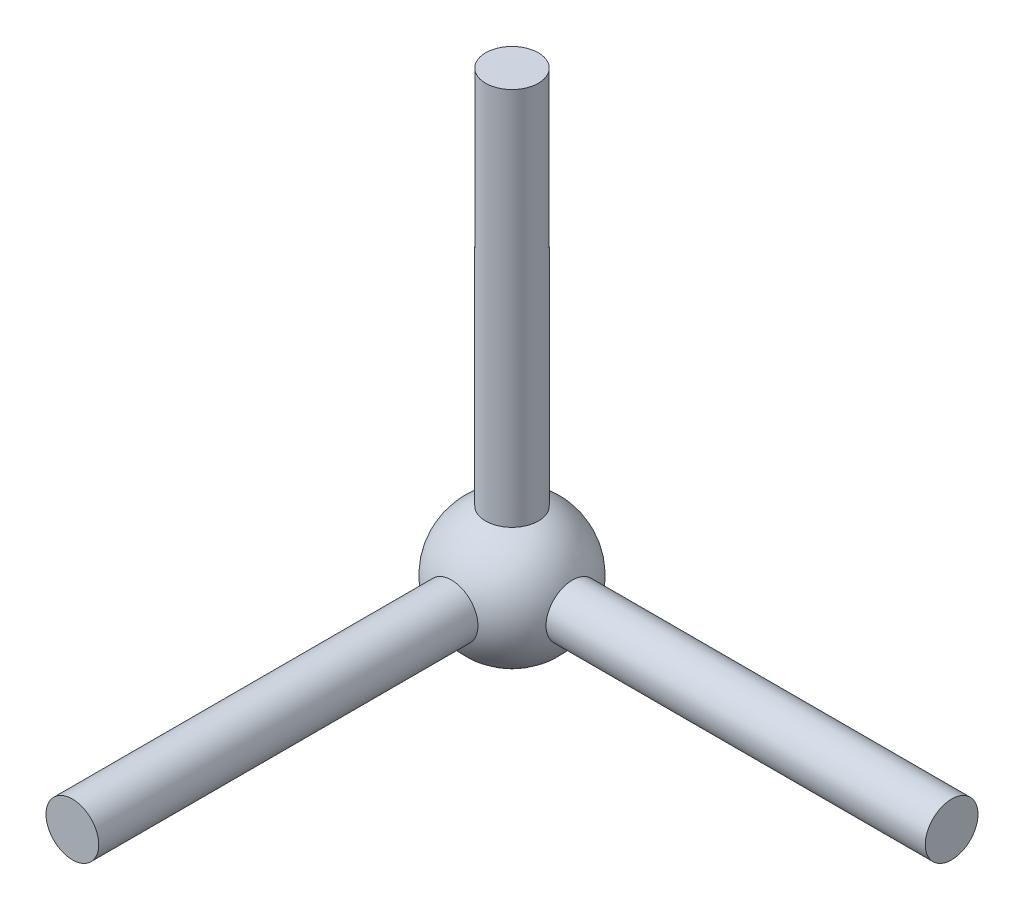
ISO-10303-21;
HEADER;
FILE_DESCRIPTION(('STEP AP214'),'2;1');
FILE_NAME('part.step','',(''),(''),'','','');
FILE_SCHEMA(('AUTOMOTIVE_DESIGN { 1 0 10303 214 1 1 1 1 }'));
ENDSEC;
DATA;
#1=APPLICATION_CONTEXT('core data for automotive mechanical design processes');
#2=APPLICATION_PROTOCOL_DEFINITION('international standard','automotive_design',2000,#1);
#3=PRODUCT_CONTEXT('',#1,'mechanical');
#4=PRODUCT('Part','Part','',(#3));
#5=PRODUCT_RELATED_PRODUCT_CATEGORY('part','',(#4));
#6=PRODUCT_DEFINITION_FORMATION('','',#4);
#7=PRODUCT_DEFINITION_CONTEXT('part definition',#1,'design');
#8=PRODUCT_DEFINITION('design','',#6,#7);
#9=PRODUCT_DEFINITION_SHAPE('','',#8);
#10=(LENGTH_UNIT() NAMED_UNIT(*) SI_UNIT(.MILLI.,.METRE.));
#11=(NAMED_UNIT(*) PLANE_ANGLE_UNIT() SI_UNIT($,.RADIAN.));
#12=(NAMED_UNIT(*) SI_UNIT($,.STERADIAN.) SOLID_ANGLE_UNIT());
#13=UNCERTAINTY_MEASURE_WITH_UNIT(LENGTH_MEASURE(1.E-05),#10,'distance_accuracy_value','');
#14=(GEOMETRIC_REPRESENTATION_CONTEXT(3) GLOBAL_UNCERTAINTY_ASSIGNED_CONTEXT((#13)) GLOBAL_UNIT_ASSIGNED_CONTEXT((#10,
#11,#12)) REPRESENTATION_CONTEXT('',''));
#15=CARTESIAN_POINT('',(0.,0.,0.));
#16=DIRECTION('',(0.,0.,1.));
#17=DIRECTION('',(1.,0.,0.));
#18=AXIS2_PLACEMENT_3D('',#15,#16,#17);
#19=CARTESIAN_POINT('',(0.,0.,0.));
#20=DIRECTION('',(0.,-1.,0.));
#21=DIRECTION('',(-1.,0.,0.));
#22=AXIS2_PLACEMENT_3D('',#19,#20,#21);
#23=SPHERICAL_SURFACE('',#22,7.5);
#24=CARTESIAN_POINT('',(0.,6.87386354243376,0.));
#25=DIRECTION('',(0.,-1.,0.));
#26=DIRECTION('',(0.,0.,-1.));
#27=AXIS2_PLACEMENT_3D('',#24,#25,#26);
#28=CIRCLE('',#27,3.);
#29=CARTESIAN_POINT('',(0.,6.87386354243376,-3.));
#30=VERTEX_POINT('',#29);
#31=EDGE_CURVE('E54',#30,#30,#28,.F.);
#32=ORIENTED_EDGE('',*,*,#31,.F.);
#33=EDGE_LOOP('',(#32));
#34=FACE_BOUND('',#33,.T.);
#35=CARTESIAN_POINT('',(0.,0.,6.87386354243376));
#36=DIRECTION('',(0.,0.,-1.));
#37=DIRECTION('',(-1.,0.,0.));
#38=AXIS2_PLACEMENT_3D('',#35,#36,#37);
#39=CIRCLE('',#38,3.);
#40=CARTESIAN_POINT('',(-3.,0.,6.87386354243376));
#41=VERTEX_POINT('',#40);
#42=EDGE_CURVE('E49',#41,#41,#39,.F.);
#43=ORIENTED_EDGE('',*,*,#42,.F.);
#44=EDGE_LOOP('',(#43));
#45=FACE_BOUND('',#44,.T.);
#46=CARTESIAN_POINT('',(6.87386354243376,0.,0.));
#47=DIRECTION('',(-1.,0.,0.));
#48=DIRECTION('',(0.,0.,1.));
#49=AXIS2_PLACEMENT_3D('',#46,#47,#48);
#50=CIRCLE('',#49,3.);
#51=CARTESIAN_POINT('',(6.87386354243376,0.,3.));
#52=VERTEX_POINT('',#51);
#53=EDGE_CURVE('E10',#52,#52,#50,.F.);
#54=ORIENTED_EDGE('',*,*,#53,.F.);
#55=EDGE_LOOP('',(#54));
#56=FACE_BOUND('',#55,.T.);
#57=ADVANCED_FACE('F42',(#34,#45,#56),#23,.T.);
#58=CARTESIAN_POINT('',(0.,50.,0.));
#59=DIRECTION('',(0.,-1.,0.));
#60=DIRECTION('',(0.,0.,-1.));
#61=AXIS2_PLACEMENT_3D('',#58,#59,#60);
#62=CYLINDRICAL_SURFACE('',#61,3.);
#63=CARTESIAN_POINT('',(0.,50.,0.));
#64=DIRECTION('',(0.,1.,0.));
#65=DIRECTION('',(0.,0.,1.));
#66=AXIS2_PLACEMENT_3D('',#63,#64,#65);
#67=CIRCLE('',#66,3.);
#68=CARTESIAN_POINT('',(0.,50.,3.));
#69=VERTEX_POINT('',#68);
#70=EDGE_CURVE('E59',#69,#69,#67,.T.);
#71=ORIENTED_EDGE('',*,*,#70,.F.);
#72=EDGE_LOOP('',(#71));
#73=FACE_BOUND('',#72,.T.);
#74=ORIENTED_EDGE('',*,*,#31,.T.);
#75=EDGE_LOOP('',(#74));
#76=FACE_BOUND('',#75,.T.);
#77=ADVANCED_FACE('F89',(#73,#76),#62,.T.);
#78=CARTESIAN_POINT('',(0.,50.,0.));
#79=DIRECTION('',(0.,1.,0.));
#80=DIRECTION('',(0.,0.,1.));
#81=AXIS2_PLACEMENT_3D('',#78,#79,#80);
#82=PLANE('',#81);
#83=ORIENTED_EDGE('',*,*,#70,.T.);
#84=EDGE_LOOP('',(#83));
#85=FACE_BOUND('',#84,.T.);
#86=ADVANCED_FACE('F94',(#85),#82,.T.);
#87=CARTESIAN_POINT('',(0.,0.,50.));
#88=DIRECTION('',(0.,0.,-1.));
#89=DIRECTION('',(-1.,0.,0.));
#90=AXIS2_PLACEMENT_3D('',#87,#88,#89);
#91=CYLINDRICAL_SURFACE('',#90,3.);
#92=CARTESIAN_POINT('',(0.,0.,50.));
#93=DIRECTION('',(0.,0.,1.));
#94=DIRECTION('',(1.,0.,0.));
#95=AXIS2_PLACEMENT_3D('',#92,#93,#94);
#96=CIRCLE('',#95,3.);
#97=CARTESIAN_POINT('',(3.,0.,50.));
#98=VERTEX_POINT('',#97);
#99=EDGE_CURVE('E65',#98,#98,#96,.T.);
#100=ORIENTED_EDGE('',*,*,#99,.F.);
#101=EDGE_LOOP('',(#100));
#102=FACE_BOUND('',#101,.T.);
#103=ORIENTED_EDGE('',*,*,#42,.T.);
#104=EDGE_LOOP('',(#103));
#105=FACE_BOUND('',#104,.T.);
#106=ADVANCED_FACE('F85',(#102,#105),#91,.T.);
#107=CARTESIAN_POINT('',(0.,0.,50.));
#108=DIRECTION('',(0.,0.,1.));
#109=DIRECTION('',(1.,0.,0.));
#110=AXIS2_PLACEMENT_3D('',#107,#108,#109);
#111=PLANE('',#110);
#112=ORIENTED_EDGE('',*,*,#99,.T.);
#113=EDGE_LOOP('',(#112));
#114=FACE_BOUND('',#113,.T.);
#115=ADVANCED_FACE('F78',(#114),#111,.T.);
#116=CARTESIAN_POINT('',(50.,0.,0.));
#117=DIRECTION('',(-1.,0.,0.));
#118=DIRECTION('',(0.,0.,1.));
#119=AXIS2_PLACEMENT_3D('',#116,#117,#118);
#120=CYLINDRICAL_SURFACE('',#119,3.);
#121=CARTESIAN_POINT('',(50.,0.,0.));
#122=DIRECTION('',(1.,0.,0.));
#123=DIRECTION('',(0.,0.,-1.));
#124=AXIS2_PLACEMENT_3D('',#121,#122,#123);
#125=CIRCLE('',#124,3.);
#126=CARTESIAN_POINT('',(50.,0.,-3.));
#127=VERTEX_POINT('',#126);
#128=EDGE_CURVE('E69',#127,#127,#125,.T.);
#129=ORIENTED_EDGE('',*,*,#128,.F.);
#130=EDGE_LOOP('',(#129));
#131=FACE_BOUND('',#130,.T.);
#132=ORIENTED_EDGE('',*,*,#53,.T.);
#133=EDGE_LOOP('',(#132));
#134=FACE_BOUND('',#133,.T.);
#135=ADVANCED_FACE('F76',(#131,#134),#120,.T.);
#136=CARTESIAN_POINT('',(50.,0.,0.));
#137=DIRECTION('',(1.,0.,0.));
#138=DIRECTION('',(0.,0.,-1.));
#139=AXIS2_PLACEMENT_3D('',#136,#137,#138);
#140=PLANE('',#139);
#141=ORIENTED_EDGE('',*,*,#128,.T.);
#142=EDGE_LOOP('',(#141));
#143=FACE_BOUND('',#142,.T.);
#144=ADVANCED_FACE('F74',(#143),#140,.T.);
#145=CLOSED_SHELL('',(#57,#77,#86,#106,#115,#135,#144));
#146=MANIFOLD_SOLID_BREP('B2',#145);
#147=ADVANCED_BREP_SHAPE_REPRESENTATION('',(#18,#146),#14);
#148=SHAPE_DEFINITION_REPRESENTATION(#9,#147);
ENDSEC;
END-ISO-10303-21;
